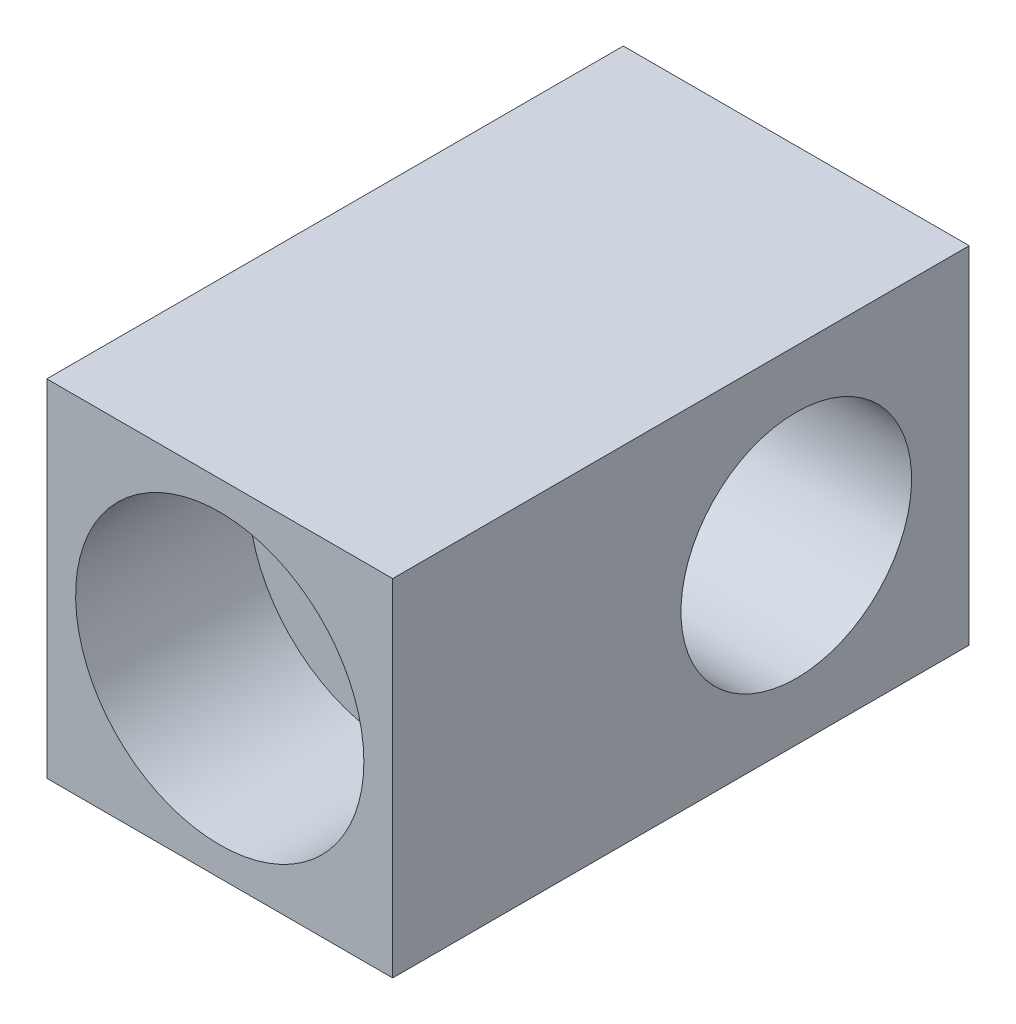
ISO-10303-21;
HEADER;
FILE_DESCRIPTION(('STEP AP214'),'2;1');
FILE_NAME('part.step','',(''),(''),'','','');
FILE_SCHEMA(('AUTOMOTIVE_DESIGN { 1 0 10303 214 1 1 1 1 }'));
ENDSEC;
DATA;
#1=APPLICATION_CONTEXT('core data for automotive mechanical design processes');
#2=APPLICATION_PROTOCOL_DEFINITION('international standard','automotive_design',2000,#1);
#3=PRODUCT_CONTEXT('',#1,'mechanical');
#4=PRODUCT('Part','Part','',(#3));
#5=PRODUCT_RELATED_PRODUCT_CATEGORY('part','',(#4));
#6=PRODUCT_DEFINITION_FORMATION('','',#4);
#7=PRODUCT_DEFINITION_CONTEXT('part definition',#1,'design');
#8=PRODUCT_DEFINITION('design','',#6,#7);
#9=PRODUCT_DEFINITION_SHAPE('','',#8);
#10=(LENGTH_UNIT() NAMED_UNIT(*) SI_UNIT(.MILLI.,.METRE.));
#11=(NAMED_UNIT(*) PLANE_ANGLE_UNIT() SI_UNIT($,.RADIAN.));
#12=(NAMED_UNIT(*) SI_UNIT($,.STERADIAN.) SOLID_ANGLE_UNIT());
#13=UNCERTAINTY_MEASURE_WITH_UNIT(LENGTH_MEASURE(1.E-05),#10,'distance_accuracy_value','');
#14=(GEOMETRIC_REPRESENTATION_CONTEXT(3) GLOBAL_UNCERTAINTY_ASSIGNED_CONTEXT((#13)) GLOBAL_UNIT_ASSIGNED_CONTEXT((#10,
#11,#12)) REPRESENTATION_CONTEXT('',''));
#15=CARTESIAN_POINT('',(0.,0.,0.));
#16=DIRECTION('',(0.,0.,1.));
#17=DIRECTION('',(1.,0.,0.));
#18=AXIS2_PLACEMENT_3D('',#15,#16,#17);
#19=CARTESIAN_POINT('',(1.5,1.5,6.));
#20=DIRECTION('',(-1.,0.,0.));
#21=DIRECTION('',(0.,-1.,0.));
#22=AXIS2_PLACEMENT_3D('',#19,#20,#21);
#23=PLANE('',#22);
#24=CARTESIAN_POINT('',(1.5,0.,1.5));
#25=DIRECTION('',(1.,0.,0.));
#26=DIRECTION('',(0.,1.,0.));
#27=AXIS2_PLACEMENT_3D('',#24,#25,#26);
#28=CIRCLE('',#27,1.);
#29=CARTESIAN_POINT('',(1.5,1.,1.5));
#30=VERTEX_POINT('',#29);
#31=EDGE_CURVE('E98',#30,#30,#28,.T.);
#32=ORIENTED_EDGE('',*,*,#31,.F.);
#33=EDGE_LOOP('',(#32));
#34=FACE_BOUND('',#33,.T.);
#35=DIRECTION('',(0.,-1.,0.));
#36=VECTOR('',#35,1.);
#37=CARTESIAN_POINT('',(1.5,0.,5.));
#38=LINE('',#37,#36);
#39=CARTESIAN_POINT('',(1.5,1.5,5.));
#40=VERTEX_POINT('',#39);
#41=CARTESIAN_POINT('',(1.5,-1.5,5.));
#42=VERTEX_POINT('',#41);
#43=EDGE_CURVE('E75',#40,#42,#38,.T.);
#44=ORIENTED_EDGE('',*,*,#43,.T.);
#45=DIRECTION('',(0.,0.,-1.));
#46=VECTOR('',#45,1.);
#47=CARTESIAN_POINT('',(1.5,-1.5,6.));
#48=LINE('',#47,#46);
#49=CARTESIAN_POINT('',(1.5,-1.5,0.));
#50=VERTEX_POINT('',#49);
#51=EDGE_CURVE('E59',#42,#50,#48,.T.);
#52=ORIENTED_EDGE('',*,*,#51,.T.);
#53=DIRECTION('',(0.,1.,0.));
#54=VECTOR('',#53,1.);
#55=CARTESIAN_POINT('',(1.5,1.5,0.));
#56=LINE('',#55,#54);
#57=CARTESIAN_POINT('',(1.5,1.5,0.));
#58=VERTEX_POINT('',#57);
#59=EDGE_CURVE('E89',#50,#58,#56,.T.);
#60=ORIENTED_EDGE('',*,*,#59,.T.);
#61=DIRECTION('',(0.,0.,-1.));
#62=VECTOR('',#61,1.);
#63=CARTESIAN_POINT('',(1.5,1.5,6.));
#64=LINE('',#63,#62);
#65=EDGE_CURVE('E11',#40,#58,#64,.T.);
#66=ORIENTED_EDGE('',*,*,#65,.F.);
#67=EDGE_LOOP('',(#44,#52,#60,#66));
#68=FACE_BOUND('',#67,.T.);
#69=ADVANCED_FACE('F35',(#34,#68),#23,.F.);
#70=CARTESIAN_POINT('',(-1.5,1.5,6.));
#71=DIRECTION('',(0.,-1.,0.));
#72=DIRECTION('',(0.,0.,-1.));
#73=AXIS2_PLACEMENT_3D('',#70,#71,#72);
#74=PLANE('',#73);
#75=DIRECTION('',(1.,0.,0.));
#76=VECTOR('',#75,1.);
#77=CARTESIAN_POINT('',(-2.5,1.5,5.));
#78=LINE('',#77,#76);
#79=CARTESIAN_POINT('',(-1.5,1.5,5.));
#80=VERTEX_POINT('',#79);
#81=EDGE_CURVE('E78',#80,#40,#78,.T.);
#82=ORIENTED_EDGE('',*,*,#81,.T.);
#83=ORIENTED_EDGE('',*,*,#65,.T.);
#84=DIRECTION('',(-1.,0.,0.));
#85=VECTOR('',#84,1.);
#86=CARTESIAN_POINT('',(-1.5,1.5,0.));
#87=LINE('',#86,#85);
#88=CARTESIAN_POINT('',(-1.5,1.5,0.));
#89=VERTEX_POINT('',#88);
#90=EDGE_CURVE('E92',#58,#89,#87,.T.);
#91=ORIENTED_EDGE('',*,*,#90,.T.);
#92=DIRECTION('',(0.,0.,-1.));
#93=VECTOR('',#92,1.);
#94=CARTESIAN_POINT('',(-1.5,1.5,6.));
#95=LINE('',#94,#93);
#96=EDGE_CURVE('E43',#80,#89,#95,.T.);
#97=ORIENTED_EDGE('',*,*,#96,.F.);
#98=EDGE_LOOP('',(#82,#83,#91,#97));
#99=FACE_BOUND('',#98,.T.);
#100=ADVANCED_FACE('F84',(#99),#74,.F.);
#101=CARTESIAN_POINT('',(-1.5,1.5,6.));
#102=DIRECTION('',(1.,0.,0.));
#103=DIRECTION('',(0.,1.,0.));
#104=AXIS2_PLACEMENT_3D('',#101,#102,#103);
#105=PLANE('',#104);
#106=CARTESIAN_POINT('',(-1.5,0.,1.5));
#107=DIRECTION('',(1.,0.,0.));
#108=DIRECTION('',(0.,1.,0.));
#109=AXIS2_PLACEMENT_3D('',#106,#107,#108);
#110=CIRCLE('',#109,1.);
#111=CARTESIAN_POINT('',(-1.5,1.,1.5));
#112=VERTEX_POINT('',#111);
#113=EDGE_CURVE('E93',#112,#112,#110,.T.);
#114=ORIENTED_EDGE('',*,*,#113,.T.);
#115=EDGE_LOOP('',(#114));
#116=FACE_BOUND('',#115,.T.);
#117=DIRECTION('',(0.,-1.,0.));
#118=VECTOR('',#117,1.);
#119=CARTESIAN_POINT('',(-1.5,1.5,5.));
#120=LINE('',#119,#118);
#121=CARTESIAN_POINT('',(-1.5,-1.5,5.));
#122=VERTEX_POINT('',#121);
#123=EDGE_CURVE('E51',#80,#122,#120,.T.);
#124=ORIENTED_EDGE('',*,*,#123,.F.);
#125=ORIENTED_EDGE('',*,*,#96,.T.);
#126=DIRECTION('',(0.,-1.,0.));
#127=VECTOR('',#126,1.);
#128=CARTESIAN_POINT('',(-1.5,1.5,0.));
#129=LINE('',#128,#127);
#130=CARTESIAN_POINT('',(-1.5,-1.5,0.));
#131=VERTEX_POINT('',#130);
#132=EDGE_CURVE('E95',#89,#131,#129,.T.);
#133=ORIENTED_EDGE('',*,*,#132,.T.);
#134=DIRECTION('',(0.,0.,-1.));
#135=VECTOR('',#134,1.);
#136=CARTESIAN_POINT('',(-1.5,-1.5,6.));
#137=LINE('',#136,#135);
#138=EDGE_CURVE('E107',#122,#131,#137,.T.);
#139=ORIENTED_EDGE('',*,*,#138,.F.);
#140=EDGE_LOOP('',(#124,#125,#133,#139));
#141=FACE_BOUND('',#140,.T.);
#142=ADVANCED_FACE('F110',(#116,#141),#105,.F.);
#143=CARTESIAN_POINT('',(-1.5,-1.5,6.));
#144=DIRECTION('',(0.,1.,0.));
#145=DIRECTION('',(0.,0.,1.));
#146=AXIS2_PLACEMENT_3D('',#143,#144,#145);
#147=PLANE('',#146);
#148=DIRECTION('',(1.,0.,0.));
#149=VECTOR('',#148,1.);
#150=CARTESIAN_POINT('',(-2.5,-1.5,5.));
#151=LINE('',#150,#149);
#152=EDGE_CURVE('E79',#122,#42,#151,.T.);
#153=ORIENTED_EDGE('',*,*,#152,.F.);
#154=ORIENTED_EDGE('',*,*,#138,.T.);
#155=DIRECTION('',(1.,0.,0.));
#156=VECTOR('',#155,1.);
#157=CARTESIAN_POINT('',(-1.5,-1.5,0.));
#158=LINE('',#157,#156);
#159=EDGE_CURVE('E104',#131,#50,#158,.T.);
#160=ORIENTED_EDGE('',*,*,#159,.T.);
#161=ORIENTED_EDGE('',*,*,#51,.F.);
#162=EDGE_LOOP('',(#153,#154,#160,#161));
#163=FACE_BOUND('',#162,.T.);
#164=ADVANCED_FACE('F115',(#163),#147,.F.);
#165=CARTESIAN_POINT('',(0.,0.,0.));
#166=DIRECTION('',(0.,0.,1.));
#167=DIRECTION('',(1.,0.,0.));
#168=AXIS2_PLACEMENT_3D('',#165,#166,#167);
#169=PLANE('',#168);
#170=ORIENTED_EDGE('',*,*,#59,.F.);
#171=ORIENTED_EDGE('',*,*,#159,.F.);
#172=ORIENTED_EDGE('',*,*,#132,.F.);
#173=ORIENTED_EDGE('',*,*,#90,.F.);
#174=EDGE_LOOP('',(#170,#171,#172,#173));
#175=FACE_BOUND('',#174,.T.);
#176=ADVANCED_FACE('F113',(#175),#169,.F.);
#177=CARTESIAN_POINT('',(-4.5,0.,1.5));
#178=DIRECTION('',(1.,0.,0.));
#179=DIRECTION('',(0.,1.,0.));
#180=AXIS2_PLACEMENT_3D('',#177,#178,#179);
#181=CYLINDRICAL_SURFACE('',#180,1.);
#182=ORIENTED_EDGE('',*,*,#31,.T.);
#183=EDGE_LOOP('',(#182));
#184=FACE_BOUND('',#183,.T.);
#185=ORIENTED_EDGE('',*,*,#113,.F.);
#186=EDGE_LOOP('',(#185));
#187=FACE_BOUND('',#186,.T.);
#188=ADVANCED_FACE('F126',(#184,#187),#181,.F.);
#189=CARTESIAN_POINT('',(-2.5,0.,5.));
#190=DIRECTION('',(0.,0.,1.));
#191=DIRECTION('',(0.,-1.,0.));
#192=AXIS2_PLACEMENT_3D('',#189,#190,#191);
#193=PLANE('',#192);
#194=CARTESIAN_POINT('',(0.,0.,5.));
#195=DIRECTION('',(0.,0.,1.));
#196=DIRECTION('',(0.,-1.,0.));
#197=AXIS2_PLACEMENT_3D('',#194,#195,#196);
#198=CIRCLE('',#197,1.25);
#199=CARTESIAN_POINT('',(0.,-1.25,5.));
#200=VERTEX_POINT('',#199);
#201=EDGE_CURVE('E38',#200,#200,#198,.F.);
#202=ORIENTED_EDGE('',*,*,#201,.T.);
#203=EDGE_LOOP('',(#202));
#204=FACE_BOUND('',#203,.T.);
#205=ORIENTED_EDGE('',*,*,#123,.T.);
#206=ORIENTED_EDGE('',*,*,#152,.T.);
#207=ORIENTED_EDGE('',*,*,#43,.F.);
#208=ORIENTED_EDGE('',*,*,#81,.F.);
#209=EDGE_LOOP('',(#205,#206,#207,#208));
#210=FACE_BOUND('',#209,.T.);
#211=ADVANCED_FACE('F77',(#204,#210),#193,.T.);
#212=CARTESIAN_POINT('',(0.,0.,3.5));
#213=DIRECTION('',(0.,0.,1.));
#214=DIRECTION('',(1.,0.,0.));
#215=AXIS2_PLACEMENT_3D('',#212,#213,#214);
#216=PLANE('',#215);
#217=CARTESIAN_POINT('',(0.,0.,3.5));
#218=DIRECTION('',(0.,0.,1.));
#219=DIRECTION('',(1.,0.,0.));
#220=AXIS2_PLACEMENT_3D('',#217,#218,#219);
#221=CIRCLE('',#220,1.25);
#222=CARTESIAN_POINT('',(1.25,0.,3.5));
#223=VERTEX_POINT('',#222);
#224=EDGE_CURVE('E119',#223,#223,#221,.T.);
#225=ORIENTED_EDGE('',*,*,#224,.T.);
#226=EDGE_LOOP('',(#225));
#227=FACE_BOUND('',#226,.T.);
#228=ADVANCED_FACE('F148',(#227),#216,.T.);
#229=CARTESIAN_POINT('',(0.,0.,3.5));
#230=DIRECTION('',(0.,0.,1.));
#231=DIRECTION('',(1.,0.,0.));
#232=AXIS2_PLACEMENT_3D('',#229,#230,#231);
#233=CYLINDRICAL_SURFACE('',#232,1.25);
#234=ORIENTED_EDGE('',*,*,#224,.F.);
#235=EDGE_LOOP('',(#234));
#236=FACE_BOUND('',#235,.T.);
#237=ORIENTED_EDGE('',*,*,#201,.F.);
#238=EDGE_LOOP('',(#237));
#239=FACE_BOUND('',#238,.T.);
#240=ADVANCED_FACE('F145',(#236,#239),#233,.F.);
#241=CLOSED_SHELL('',(#69,#100,#142,#164,#176,#188,#211,#228,#240));
#242=MANIFOLD_SOLID_BREP('B2',#241);
#243=ADVANCED_BREP_SHAPE_REPRESENTATION('',(#18,#242),#14);
#244=SHAPE_DEFINITION_REPRESENTATION(#9,#243);
ENDSEC;
END-ISO-10303-21;
